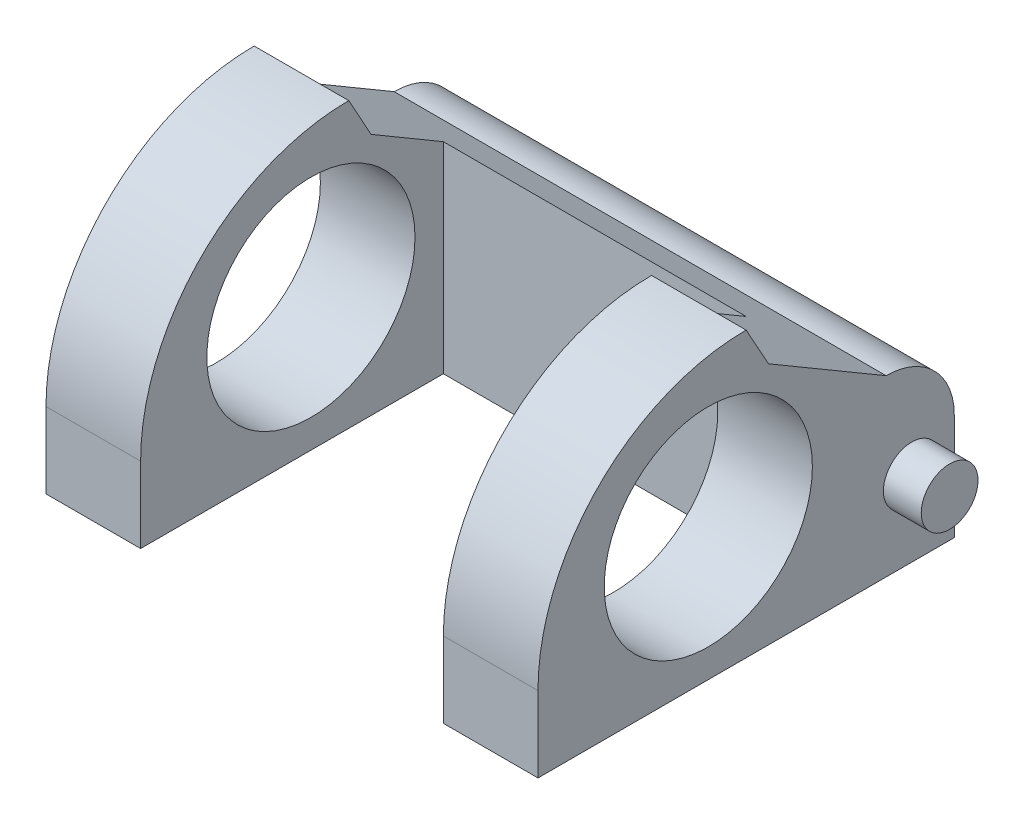
ISO-10303-21;
HEADER;
FILE_DESCRIPTION(('STEP AP214'),'2;1');
FILE_NAME('part.step','',(''),(''),'','','');
FILE_SCHEMA(('AUTOMOTIVE_DESIGN { 1 0 10303 214 1 1 1 1 }'));
ENDSEC;
DATA;
#1=APPLICATION_CONTEXT('core data for automotive mechanical design processes');
#2=APPLICATION_PROTOCOL_DEFINITION('international standard','automotive_design',2000,#1);
#3=PRODUCT_CONTEXT('',#1,'mechanical');
#4=PRODUCT('Part','Part','',(#3));
#5=PRODUCT_RELATED_PRODUCT_CATEGORY('part','',(#4));
#6=PRODUCT_DEFINITION_FORMATION('','',#4);
#7=PRODUCT_DEFINITION_CONTEXT('part definition',#1,'design');
#8=PRODUCT_DEFINITION('design','',#6,#7);
#9=PRODUCT_DEFINITION_SHAPE('','',#8);
#10=(LENGTH_UNIT() NAMED_UNIT(*) SI_UNIT(.MILLI.,.METRE.));
#11=(NAMED_UNIT(*) PLANE_ANGLE_UNIT() SI_UNIT($,.RADIAN.));
#12=(NAMED_UNIT(*) SI_UNIT($,.STERADIAN.) SOLID_ANGLE_UNIT());
#13=UNCERTAINTY_MEASURE_WITH_UNIT(LENGTH_MEASURE(1.E-05),#10,'distance_accuracy_value','');
#14=(GEOMETRIC_REPRESENTATION_CONTEXT(3) GLOBAL_UNCERTAINTY_ASSIGNED_CONTEXT((#13)) GLOBAL_UNIT_ASSIGNED_CONTEXT((#10,
#11,#12)) REPRESENTATION_CONTEXT('',''));
#15=CARTESIAN_POINT('',(0.,0.,0.));
#16=DIRECTION('',(0.,0.,1.));
#17=DIRECTION('',(1.,0.,0.));
#18=AXIS2_PLACEMENT_3D('',#15,#16,#17);
#19=CARTESIAN_POINT('',(-6.5,10.,5.5));
#20=DIRECTION('',(0.,0.,-1.));
#21=DIRECTION('',(-1.,0.,0.));
#22=AXIS2_PLACEMENT_3D('',#19,#20,#21);
#23=PLANE('',#22);
#24=DIRECTION('',(1.,0.,0.));
#25=VECTOR('',#24,1.);
#26=CARTESIAN_POINT('',(-6.5,2.,5.5));
#27=LINE('',#26,#25);
#28=CARTESIAN_POINT('',(4.,2.,5.5));
#29=VERTEX_POINT('',#28);
#30=CARTESIAN_POINT('',(6.5,2.,5.5));
#31=VERTEX_POINT('',#30);
#32=EDGE_CURVE('E279',#29,#31,#27,.T.);
#33=ORIENTED_EDGE('',*,*,#32,.F.);
#34=DIRECTION('',(0.,-1.,0.));
#35=VECTOR('',#34,1.);
#36=CARTESIAN_POINT('',(4.,7.5,5.5));
#37=LINE('',#36,#35);
#38=CARTESIAN_POINT('',(4.,0.,5.5));
#39=VERTEX_POINT('',#38);
#40=EDGE_CURVE('E182',#29,#39,#37,.T.);
#41=ORIENTED_EDGE('',*,*,#40,.T.);
#42=DIRECTION('',(1.,0.,0.));
#43=VECTOR('',#42,1.);
#44=CARTESIAN_POINT('',(-6.5,0.,5.5));
#45=LINE('',#44,#43);
#46=CARTESIAN_POINT('',(6.5,0.,5.5));
#47=VERTEX_POINT('',#46);
#48=EDGE_CURVE('E87',#39,#47,#45,.T.);
#49=ORIENTED_EDGE('',*,*,#48,.T.);
#50=DIRECTION('',(0.,-1.,0.));
#51=VECTOR('',#50,1.);
#52=CARTESIAN_POINT('',(6.5,10.,5.5));
#53=LINE('',#52,#51);
#54=EDGE_CURVE('E306',#31,#47,#53,.T.);
#55=ORIENTED_EDGE('',*,*,#54,.F.);
#56=EDGE_LOOP('',(#33,#41,#49,#55));
#57=FACE_BOUND('',#56,.T.);
#58=ADVANCED_FACE('F63',(#57),#23,.F.);
#59=CARTESIAN_POINT('',(-6.5,1.75754402478739,-3.17688828680512));
#60=DIRECTION('',(0.,-0.484085946196526,0.875020455015204));
#61=DIRECTION('',(0.,-0.875020455015204,-0.484085946196526));
#62=AXIS2_PLACEMENT_3D('',#59,#60,#61);
#63=PLANE('',#62);
#64=DIRECTION('',(1.,0.,0.));
#65=VECTOR('',#64,1.);
#66=CARTESIAN_POINT('',(-6.5,6.43285410885197,-0.590375145501196));
#67=LINE('',#66,#65);
#68=CARTESIAN_POINT('',(4.,6.43285410885197,-0.590375145501196));
#69=VERTEX_POINT('',#68);
#70=CARTESIAN_POINT('',(6.5,6.43285410885197,-0.590375145501199));
#71=VERTEX_POINT('',#70);
#72=EDGE_CURVE('E270',#69,#71,#67,.T.);
#73=ORIENTED_EDGE('',*,*,#72,.F.);
#74=DIRECTION('',(0.,0.875020455015204,0.484085946196526));
#75=VECTOR('',#74,1.);
#76=CARTESIAN_POINT('',(4.,1.75754402478739,-3.17688828680512));
#77=LINE('',#76,#75);
#78=CARTESIAN_POINT('',(4.,7.5,0.));
#79=VERTEX_POINT('',#78);
#80=EDGE_CURVE('E211',#69,#79,#77,.T.);
#81=ORIENTED_EDGE('',*,*,#80,.T.);
#82=DIRECTION('',(1.,0.,0.));
#83=VECTOR('',#82,1.);
#84=CARTESIAN_POINT('',(-6.5,7.5,0.));
#85=LINE('',#84,#83);
#86=CARTESIAN_POINT('',(6.5,7.5,0.));
#87=VERTEX_POINT('',#86);
#88=EDGE_CURVE('E275',#79,#87,#85,.T.);
#89=ORIENTED_EDGE('',*,*,#88,.T.);
#90=DIRECTION('',(0.,-0.875020455015204,-0.484085946196526));
#91=VECTOR('',#90,1.);
#92=CARTESIAN_POINT('',(6.5,1.75754402478739,-3.17688828680512));
#93=LINE('',#92,#91);
#94=EDGE_CURVE('E255',#87,#71,#93,.T.);
#95=ORIENTED_EDGE('',*,*,#94,.T.);
#96=EDGE_LOOP('',(#73,#81,#89,#95));
#97=FACE_BOUND('',#96,.T.);
#98=ADVANCED_FACE('F370',(#97),#63,.F.);
#99=CARTESIAN_POINT('',(-6.5,2.,0.));
#100=DIRECTION('',(1.,0.,0.));
#101=DIRECTION('',(0.,0.,-1.));
#102=AXIS2_PLACEMENT_3D('',#99,#100,#101);
#103=CYLINDRICAL_SURFACE('',#102,5.5);
#104=CARTESIAN_POINT('',(4.,2.,0.));
#105=DIRECTION('',(1.,0.,0.));
#106=DIRECTION('',(0.,0.,-1.));
#107=AXIS2_PLACEMENT_3D('',#104,#105,#106);
#108=CIRCLE('',#107,5.5);
#109=EDGE_CURVE('E215',#29,#79,#108,.F.);
#110=ORIENTED_EDGE('',*,*,#109,.F.);
#111=ORIENTED_EDGE('',*,*,#32,.T.);
#112=CARTESIAN_POINT('',(6.5,2.,0.));
#113=DIRECTION('',(1.,0.,0.));
#114=DIRECTION('',(0.,0.,-1.));
#115=AXIS2_PLACEMENT_3D('',#112,#113,#114);
#116=CIRCLE('',#115,5.5);
#117=EDGE_CURVE('E251',#87,#31,#116,.T.);
#118=ORIENTED_EDGE('',*,*,#117,.F.);
#119=ORIENTED_EDGE('',*,*,#88,.F.);
#120=EDGE_LOOP('',(#110,#111,#118,#119));
#121=FACE_BOUND('',#120,.T.);
#122=ADVANCED_FACE('F387',(#121),#103,.T.);
#123=CARTESIAN_POINT('',(-6.5,3.5,1.));
#124=DIRECTION('',(1.,0.,0.));
#125=DIRECTION('',(0.,0.,-1.));
#126=AXIS2_PLACEMENT_3D('',#123,#124,#125);
#127=CYLINDRICAL_SURFACE('',#126,2.75);
#128=CARTESIAN_POINT('',(4.,3.5,1.));
#129=DIRECTION('',(1.,0.,0.));
#130=DIRECTION('',(0.,0.,-1.));
#131=AXIS2_PLACEMENT_3D('',#128,#129,#130);
#132=CIRCLE('',#131,2.75);
#133=CARTESIAN_POINT('',(4.,3.5,-1.75));
#134=VERTEX_POINT('',#133);
#135=EDGE_CURVE('E218',#134,#134,#132,.F.);
#136=CARTESIAN_POINT('',(6.5,3.5,1.));
#137=DIRECTION('',(1.,0.,0.));
#138=DIRECTION('',(0.,0.,-1.));
#139=AXIS2_PLACEMENT_3D('',#136,#137,#138);
#140=CIRCLE('',#139,2.75);
#141=CARTESIAN_POINT('',(6.5,3.5,-1.75));
#142=VERTEX_POINT('',#141);
#143=EDGE_CURVE('E265',#142,#142,#140,.T.);
#144=CARTESIAN_POINT('',(4.,3.5,-1.75));
#145=CARTESIAN_POINT('',(4.02604166666667,3.5,-1.75));
#146=CARTESIAN_POINT('',(4.05208333333334,3.5,-1.75));
#147=CARTESIAN_POINT('',(4.10416666666667,3.5,-1.75));
#148=CARTESIAN_POINT('',(4.13020833333334,3.5,-1.75));
#149=CARTESIAN_POINT('',(4.18229166666667,3.5,-1.75));
#150=CARTESIAN_POINT('',(4.20833333333334,3.5,-1.75));
#151=CARTESIAN_POINT('',(4.26041666666667,3.5,-1.75));
#152=CARTESIAN_POINT('',(4.28645833333334,3.5,-1.75));
#153=CARTESIAN_POINT('',(4.33854166666667,3.5,-1.75));
#154=CARTESIAN_POINT('',(4.36458333333334,3.5,-1.75));
#155=CARTESIAN_POINT('',(4.41666666666667,3.5,-1.75));
#156=CARTESIAN_POINT('',(4.44270833333334,3.5,-1.75));
#157=CARTESIAN_POINT('',(4.49479166666667,3.5,-1.75));
#158=CARTESIAN_POINT('',(4.52083333333334,3.5,-1.75));
#159=CARTESIAN_POINT('',(4.57291666666667,3.5,-1.75));
#160=CARTESIAN_POINT('',(4.59895833333334,3.5,-1.75));
#161=CARTESIAN_POINT('',(4.65104166666667,3.5,-1.75));
#162=CARTESIAN_POINT('',(4.67708333333334,3.5,-1.75));
#163=CARTESIAN_POINT('',(4.72916666666667,3.5,-1.75));
#164=CARTESIAN_POINT('',(4.75520833333334,3.5,-1.75));
#165=CARTESIAN_POINT('',(4.80729166666667,3.5,-1.75));
#166=CARTESIAN_POINT('',(4.83333333333334,3.5,-1.75));
#167=CARTESIAN_POINT('',(4.88541666666667,3.5,-1.75));
#168=CARTESIAN_POINT('',(4.91145833333334,3.5,-1.75));
#169=CARTESIAN_POINT('',(4.96354166666667,3.5,-1.75));
#170=CARTESIAN_POINT('',(4.98958333333334,3.5,-1.75));
#171=CARTESIAN_POINT('',(5.04166666666667,3.5,-1.75));
#172=CARTESIAN_POINT('',(5.06770833333334,3.5,-1.75));
#173=CARTESIAN_POINT('',(5.11979166666667,3.5,-1.75));
#174=CARTESIAN_POINT('',(5.14583333333334,3.5,-1.75));
#175=CARTESIAN_POINT('',(5.19791666666667,3.5,-1.75));
#176=CARTESIAN_POINT('',(5.22395833333334,3.5,-1.75));
#177=CARTESIAN_POINT('',(5.27604166666667,3.5,-1.75));
#178=CARTESIAN_POINT('',(5.30208333333334,3.5,-1.75));
#179=CARTESIAN_POINT('',(5.35416666666667,3.5,-1.75));
#180=CARTESIAN_POINT('',(5.38020833333334,3.5,-1.75));
#181=CARTESIAN_POINT('',(5.43229166666667,3.5,-1.75));
#182=CARTESIAN_POINT('',(5.45833333333334,3.5,-1.75));
#183=CARTESIAN_POINT('',(5.51041666666667,3.5,-1.75));
#184=CARTESIAN_POINT('',(5.53645833333334,3.5,-1.75));
#185=CARTESIAN_POINT('',(5.58854166666667,3.5,-1.75));
#186=CARTESIAN_POINT('',(5.61458333333333,3.5,-1.75));
#187=CARTESIAN_POINT('',(5.66666666666667,3.5,-1.75));
#188=CARTESIAN_POINT('',(5.69270833333333,3.5,-1.75));
#189=CARTESIAN_POINT('',(5.74479166666667,3.5,-1.75));
#190=CARTESIAN_POINT('',(5.77083333333333,3.5,-1.75));
#191=CARTESIAN_POINT('',(5.82291666666667,3.5,-1.75));
#192=CARTESIAN_POINT('',(5.84895833333333,3.5,-1.75));
#193=CARTESIAN_POINT('',(5.90104166666667,3.5,-1.75));
#194=CARTESIAN_POINT('',(5.92708333333333,3.5,-1.75));
#195=CARTESIAN_POINT('',(5.97916666666667,3.5,-1.75));
#196=CARTESIAN_POINT('',(6.00520833333333,3.5,-1.75));
#197=CARTESIAN_POINT('',(6.05729166666667,3.5,-1.75));
#198=CARTESIAN_POINT('',(6.08333333333333,3.5,-1.75));
#199=CARTESIAN_POINT('',(6.13541666666667,3.5,-1.75));
#200=CARTESIAN_POINT('',(6.16145833333333,3.5,-1.75));
#201=CARTESIAN_POINT('',(6.21354166666667,3.5,-1.75));
#202=CARTESIAN_POINT('',(6.23958333333333,3.5,-1.75));
#203=CARTESIAN_POINT('',(6.29166666666667,3.5,-1.75));
#204=CARTESIAN_POINT('',(6.31770833333333,3.5,-1.75));
#205=CARTESIAN_POINT('',(6.36979166666667,3.5,-1.75));
#206=CARTESIAN_POINT('',(6.39583333333333,3.5,-1.75));
#207=CARTESIAN_POINT('',(6.44791666666667,3.5,-1.75));
#208=CARTESIAN_POINT('',(6.47395833333333,3.5,-1.75));
#209=CARTESIAN_POINT('',(6.5,3.5,-1.75));
#210=B_SPLINE_CURVE_WITH_KNOTS('',3,(#144,#145,#146,#147,#148,#149,#150,#151,#152,#153,#154,
#155,#156,#157,#158,#159,#160,#161,#162,#163,#164,#165,#166,#167,#168,#169,#170,#171,#172,#173,
#174,#175,#176,#177,#178,#179,#180,#181,#182,#183,#184,#185,#186,#187,#188,#189,#190,#191,#192,
#193,#194,#195,#196,#197,#198,#199,#200,#201,#202,#203,#204,#205,#206,#207,#208,#209),
.UNSPECIFIED.,.F.,.F.,(4,2,2,2,2,2,2,2,2,2,2,2,2,2,2,2,2,2,2,2,2,2,2,2,2,2,2,2,2,2,2,2,4),(0.,
0.0781250000000001,0.15625,0.234375,0.3125,0.390624999999999,0.468749999999999,
0.546874999999999,0.624999999999999,0.703124999999999,0.781249999999999,0.859374999999999,
0.937499999999997,1.015625,1.09375,1.171875,1.25,1.328125,1.40625,1.484375,1.5625,1.640625,
1.71875,1.796875,1.875,1.953125,2.03125,2.109375,2.1875,2.265625,2.34375,2.421875,2.5),.UNSPECIFIED.);
#211=EDGE_CURVE('BSEAM395',#134,#142,#210,.T.);
#212=ORIENTED_EDGE('',*,*,#135,.T.);
#213=ORIENTED_EDGE('',*,*,#143,.T.);
#214=ORIENTED_EDGE('',*,*,#211,.T.);
#215=ORIENTED_EDGE('',*,*,#211,.F.);
#216=EDGE_LOOP('',(#212,#214,#213,#215));
#217=FACE_BOUND('',#216,.T.);
#218=ADVANCED_FACE('F395',(#217),#127,.F.);
#219=CARTESIAN_POINT('',(6.5,10.,-5.5));
#220=DIRECTION('',(-1.,0.,0.));
#221=DIRECTION('',(0.,0.,1.));
#222=AXIS2_PLACEMENT_3D('',#219,#220,#221);
#223=PLANE('',#222);
#224=CARTESIAN_POINT('',(6.5,2.,-4.37642552574147));
#225=DIRECTION('',(-1.,0.,0.));
#226=DIRECTION('',(0.,0.,1.));
#227=AXIS2_PLACEMENT_3D('',#224,#225,#226);
#228=CIRCLE('',#227,0.75);
#229=CARTESIAN_POINT('',(6.5,2.,-3.62642552574147));
#230=VERTEX_POINT('',#229);
#231=EDGE_CURVE('E318',#230,#230,#228,.F.);
#232=ORIENTED_EDGE('',*,*,#231,.F.);
#233=EDGE_LOOP('',(#232));
#234=FACE_BOUND('',#233,.T.);
#235=ORIENTED_EDGE('',*,*,#143,.F.);
#236=EDGE_LOOP('',(#235));
#237=FACE_BOUND('',#236,.T.);
#238=CARTESIAN_POINT('',(6.5,2.80540416797783,-3.69896475102631));
#239=DIRECTION('',(1.,0.,0.));
#240=DIRECTION('',(0.,0.,-1.));
#241=AXIS2_PLACEMENT_3D('',#238,#239,#240);
#242=CIRCLE('',#241,1.80103524897368);
#243=CARTESIAN_POINT('',(6.5,2.80540416797783,-5.5));
#244=VERTEX_POINT('',#243);
#245=CARTESIAN_POINT('',(6.5,4.60643941695151,-3.69896475102631));
#246=VERTEX_POINT('',#245);
#247=EDGE_CURVE('E232',#244,#246,#242,.T.);
#248=ORIENTED_EDGE('',*,*,#247,.T.);
#249=DIRECTION('',(0.,-0.506573440578903,-0.862196815872138));
#250=VECTOR('',#249,1.);
#251=CARTESIAN_POINT('',(6.5,5.03993242820856,-2.96115209827151));
#252=LINE('',#251,#250);
#253=EDGE_CURVE('E236',#71,#246,#252,.T.);
#254=ORIENTED_EDGE('',*,*,#253,.F.);
#255=ORIENTED_EDGE('',*,*,#94,.F.);
#256=ORIENTED_EDGE('',*,*,#117,.T.);
#257=ORIENTED_EDGE('',*,*,#54,.T.);
#258=DIRECTION('',(0.,0.,-1.));
#259=VECTOR('',#258,1.);
#260=CARTESIAN_POINT('',(6.5,0.,-5.5));
#261=LINE('',#260,#259);
#262=CARTESIAN_POINT('',(6.5,0.,-5.5));
#263=VERTEX_POINT('',#262);
#264=EDGE_CURVE('E287',#47,#263,#261,.T.);
#265=ORIENTED_EDGE('',*,*,#264,.T.);
#266=DIRECTION('',(0.,-1.,0.));
#267=VECTOR('',#266,1.);
#268=CARTESIAN_POINT('',(6.5,10.,-5.5));
#269=LINE('',#268,#267);
#270=EDGE_CURVE('E315',#244,#263,#269,.T.);
#271=ORIENTED_EDGE('',*,*,#270,.F.);
#272=EDGE_LOOP('',(#248,#254,#255,#256,#257,#265,#271));
#273=FACE_BOUND('',#272,.T.);
#274=ADVANCED_FACE('F65',(#234,#237,#273),#223,.F.);
#275=CARTESIAN_POINT('',(-6.5,10.,-5.5));
#276=DIRECTION('',(1.,0.,0.));
#277=DIRECTION('',(0.,0.,-1.));
#278=AXIS2_PLACEMENT_3D('',#275,#276,#277);
#279=PLANE('',#278);
#280=CARTESIAN_POINT('',(-6.5,2.,-4.37642552574147));
#281=DIRECTION('',(1.,0.,0.));
#282=DIRECTION('',(0.,0.,-1.));
#283=AXIS2_PLACEMENT_3D('',#280,#281,#282);
#284=CIRCLE('',#283,0.75);
#285=CARTESIAN_POINT('',(-6.5,2.,-5.12642552574147));
#286=VERTEX_POINT('',#285);
#287=EDGE_CURVE('E222',#286,#286,#284,.T.);
#288=ORIENTED_EDGE('',*,*,#287,.T.);
#289=EDGE_LOOP('',(#288));
#290=FACE_BOUND('',#289,.T.);
#291=CARTESIAN_POINT('',(-6.5,3.5,1.));
#292=DIRECTION('',(1.,0.,0.));
#293=DIRECTION('',(0.,0.,-1.));
#294=AXIS2_PLACEMENT_3D('',#291,#292,#293);
#295=CIRCLE('',#294,2.75);
#296=CARTESIAN_POINT('',(-6.5,3.5,-1.75));
#297=VERTEX_POINT('',#296);
#298=EDGE_CURVE('E283',#297,#297,#295,.T.);
#299=ORIENTED_EDGE('',*,*,#298,.T.);
#300=EDGE_LOOP('',(#299));
#301=FACE_BOUND('',#300,.T.);
#302=CARTESIAN_POINT('',(-6.5,2.80540416797783,-3.69896475102631));
#303=DIRECTION('',(1.,0.,0.));
#304=DIRECTION('',(0.,0.,-1.));
#305=AXIS2_PLACEMENT_3D('',#302,#303,#304);
#306=CIRCLE('',#305,1.80103524897368);
#307=CARTESIAN_POINT('',(-6.5,2.80540416797783,-5.5));
#308=VERTEX_POINT('',#307);
#309=CARTESIAN_POINT('',(-6.5,4.60643941695151,-3.69896475102631));
#310=VERTEX_POINT('',#309);
#311=EDGE_CURVE('E233',#308,#310,#306,.T.);
#312=ORIENTED_EDGE('',*,*,#311,.F.);
#313=DIRECTION('',(0.,-1.,0.));
#314=VECTOR('',#313,1.);
#315=CARTESIAN_POINT('',(-6.5,10.,-5.5));
#316=LINE('',#315,#314);
#317=CARTESIAN_POINT('',(-6.5,0.,-5.5));
#318=VERTEX_POINT('',#317);
#319=EDGE_CURVE('E312',#308,#318,#316,.T.);
#320=ORIENTED_EDGE('',*,*,#319,.T.);
#321=DIRECTION('',(0.,0.,1.));
#322=VECTOR('',#321,1.);
#323=CARTESIAN_POINT('',(-6.5,0.,-5.5));
#324=LINE('',#323,#322);
#325=CARTESIAN_POINT('',(-6.5,0.,5.5));
#326=VERTEX_POINT('',#325);
#327=EDGE_CURVE('E298',#318,#326,#324,.T.);
#328=ORIENTED_EDGE('',*,*,#327,.T.);
#329=DIRECTION('',(0.,-1.,0.));
#330=VECTOR('',#329,1.);
#331=CARTESIAN_POINT('',(-6.5,10.,5.5));
#332=LINE('',#331,#330);
#333=CARTESIAN_POINT('',(-6.5,2.,5.5));
#334=VERTEX_POINT('',#333);
#335=EDGE_CURVE('E309',#334,#326,#332,.T.);
#336=ORIENTED_EDGE('',*,*,#335,.F.);
#337=CARTESIAN_POINT('',(-6.5,2.,0.));
#338=DIRECTION('',(1.,0.,0.));
#339=DIRECTION('',(0.,0.,-1.));
#340=AXIS2_PLACEMENT_3D('',#337,#338,#339);
#341=CIRCLE('',#340,5.5);
#342=CARTESIAN_POINT('',(-6.5,7.5,0.));
#343=VERTEX_POINT('',#342);
#344=EDGE_CURVE('E79',#343,#334,#341,.T.);
#345=ORIENTED_EDGE('',*,*,#344,.F.);
#346=DIRECTION('',(0.,-0.875020455015204,-0.484085946196526));
#347=VECTOR('',#346,1.);
#348=CARTESIAN_POINT('',(-6.5,1.75754402478739,-3.17688828680512));
#349=LINE('',#348,#347);
#350=CARTESIAN_POINT('',(-6.5,6.43285410885197,-0.590375145501196));
#351=VERTEX_POINT('',#350);
#352=EDGE_CURVE('E239',#343,#351,#349,.T.);
#353=ORIENTED_EDGE('',*,*,#352,.T.);
#354=DIRECTION('',(0.,-0.506573440578903,-0.862196815872138));
#355=VECTOR('',#354,1.);
#356=CARTESIAN_POINT('',(-6.5,5.03993242820856,-2.9611520982715));
#357=LINE('',#356,#355);
#358=EDGE_CURVE('E243',#351,#310,#357,.T.);
#359=ORIENTED_EDGE('',*,*,#358,.T.);
#360=EDGE_LOOP('',(#312,#320,#328,#336,#345,#353,#359));
#361=FACE_BOUND('',#360,.T.);
#362=ADVANCED_FACE('F345',(#290,#301,#361),#279,.F.);
#363=CARTESIAN_POINT('',(-4.,0.,5.5));
#364=VERTEX_POINT('',#363);
#365=EDGE_CURVE('E302',#326,#364,#45,.T.);
#366=ORIENTED_EDGE('',*,*,#365,.T.);
#367=DIRECTION('',(0.,-1.,0.));
#368=VECTOR('',#367,1.);
#369=CARTESIAN_POINT('',(-4.,7.5,5.5));
#370=LINE('',#369,#368);
#371=CARTESIAN_POINT('',(-4.,2.,5.5));
#372=VERTEX_POINT('',#371);
#373=EDGE_CURVE('E189',#372,#364,#370,.T.);
#374=ORIENTED_EDGE('',*,*,#373,.F.);
#375=EDGE_CURVE('E276',#334,#372,#27,.T.);
#376=ORIENTED_EDGE('',*,*,#375,.F.);
#377=ORIENTED_EDGE('',*,*,#335,.T.);
#378=EDGE_LOOP('',(#366,#374,#376,#377));
#379=FACE_BOUND('',#378,.T.);
#380=ADVANCED_FACE('F349',(#379),#23,.F.);
#381=CARTESIAN_POINT('',(-6.5,10.,-5.5));
#382=DIRECTION('',(0.,0.,1.));
#383=DIRECTION('',(1.,0.,0.));
#384=AXIS2_PLACEMENT_3D('',#381,#382,#383);
#385=PLANE('',#384);
#386=ORIENTED_EDGE('',*,*,#319,.F.);
#387=DIRECTION('',(1.,0.,0.));
#388=VECTOR('',#387,1.);
#389=CARTESIAN_POINT('',(-6.5,2.80540416797783,-5.5));
#390=LINE('',#389,#388);
#391=EDGE_CURVE('E247',#308,#244,#390,.T.);
#392=ORIENTED_EDGE('',*,*,#391,.T.);
#393=ORIENTED_EDGE('',*,*,#270,.T.);
#394=DIRECTION('',(-1.,0.,0.));
#395=VECTOR('',#394,1.);
#396=CARTESIAN_POINT('',(-6.5,0.,-5.5));
#397=LINE('',#396,#395);
#398=EDGE_CURVE('E294',#263,#318,#397,.T.);
#399=ORIENTED_EDGE('',*,*,#398,.T.);
#400=EDGE_LOOP('',(#386,#392,#393,#399));
#401=FACE_BOUND('',#400,.T.);
#402=ADVANCED_FACE('F374',(#401),#385,.F.);
#403=CARTESIAN_POINT('',(0.,0.,0.));
#404=DIRECTION('',(0.,1.,0.));
#405=DIRECTION('',(0.,0.,1.));
#406=AXIS2_PLACEMENT_3D('',#403,#404,#405);
#407=PLANE('',#406);
#408=ORIENTED_EDGE('',*,*,#48,.F.);
#409=DIRECTION('',(0.,0.,1.));
#410=VECTOR('',#409,1.);
#411=CARTESIAN_POINT('',(4.,0.,5.5));
#412=LINE('',#411,#410);
#413=CARTESIAN_POINT('',(4.,0.,-2.5));
#414=VERTEX_POINT('',#413);
#415=EDGE_CURVE('E180',#414,#39,#412,.T.);
#416=ORIENTED_EDGE('',*,*,#415,.F.);
#417=DIRECTION('',(1.,0.,0.));
#418=VECTOR('',#417,1.);
#419=CARTESIAN_POINT('',(3.5,0.,-2.5));
#420=LINE('',#419,#418);
#421=CARTESIAN_POINT('',(-4.,0.,-2.5));
#422=VERTEX_POINT('',#421);
#423=EDGE_CURVE('E162',#422,#414,#420,.T.);
#424=ORIENTED_EDGE('',*,*,#423,.F.);
#425=DIRECTION('',(0.,0.,-1.));
#426=VECTOR('',#425,1.);
#427=CARTESIAN_POINT('',(-4.,0.,5.5));
#428=LINE('',#427,#426);
#429=EDGE_CURVE('E195',#364,#422,#428,.T.);
#430=ORIENTED_EDGE('',*,*,#429,.F.);
#431=ORIENTED_EDGE('',*,*,#365,.F.);
#432=ORIENTED_EDGE('',*,*,#327,.F.);
#433=ORIENTED_EDGE('',*,*,#398,.F.);
#434=ORIENTED_EDGE('',*,*,#264,.F.);
#435=EDGE_LOOP('',(#408,#416,#424,#430,#431,#432,#433,#434));
#436=FACE_BOUND('',#435,.T.);
#437=ADVANCED_FACE('F184',(#436),#407,.F.);
#438=CARTESIAN_POINT('',(-6.5,2.80540416797783,-3.69896475102631));
#439=DIRECTION('',(1.,0.,0.));
#440=DIRECTION('',(0.,0.,-1.));
#441=AXIS2_PLACEMENT_3D('',#438,#439,#440);
#442=CYLINDRICAL_SURFACE('',#441,1.80103524897368);
#443=ORIENTED_EDGE('',*,*,#247,.F.);
#444=ORIENTED_EDGE('',*,*,#391,.F.);
#445=ORIENTED_EDGE('',*,*,#311,.T.);
#446=DIRECTION('',(1.,0.,0.));
#447=VECTOR('',#446,1.);
#448=CARTESIAN_POINT('',(-6.5,4.60643941695151,-3.69896475102631));
#449=LINE('',#448,#447);
#450=EDGE_CURVE('E262',#310,#246,#449,.T.);
#451=ORIENTED_EDGE('',*,*,#450,.T.);
#452=EDGE_LOOP('',(#443,#444,#445,#451));
#453=FACE_BOUND('',#452,.T.);
#454=ADVANCED_FACE('F373',(#453),#442,.T.);
#455=CARTESIAN_POINT('',(-6.5,5.03993242820856,-2.9611520982715));
#456=DIRECTION('',(0.,-0.862196815872138,0.506573440578903));
#457=DIRECTION('',(0.,-0.506573440578902,-0.862196815872138));
#458=AXIS2_PLACEMENT_3D('',#455,#456,#457);
#459=PLANE('',#458);
#460=DIRECTION('',(1.,0.,0.));
#461=VECTOR('',#460,1.);
#462=CARTESIAN_POINT('',(-6.5,5.31087683527561,-2.5));
#463=LINE('',#462,#461);
#464=CARTESIAN_POINT('',(-4.,5.31087683527561,-2.5));
#465=VERTEX_POINT('',#464);
#466=CARTESIAN_POINT('',(4.,5.31087683527561,-2.5));
#467=VERTEX_POINT('',#466);
#468=EDGE_CURVE('E72',#465,#467,#463,.T.);
#469=ORIENTED_EDGE('',*,*,#468,.T.);
#470=DIRECTION('',(0.,0.506573440578902,0.862196815872138));
#471=VECTOR('',#470,1.);
#472=CARTESIAN_POINT('',(4.,5.03993242820856,-2.9611520982715));
#473=LINE('',#472,#471);
#474=EDGE_CURVE('E12',#467,#69,#473,.T.);
#475=ORIENTED_EDGE('',*,*,#474,.T.);
#476=ORIENTED_EDGE('',*,*,#72,.T.);
#477=ORIENTED_EDGE('',*,*,#253,.T.);
#478=ORIENTED_EDGE('',*,*,#450,.F.);
#479=ORIENTED_EDGE('',*,*,#358,.F.);
#480=CARTESIAN_POINT('',(-4.,6.43285410885197,-0.590375145501196));
#481=VERTEX_POINT('',#480);
#482=EDGE_CURVE('E266',#351,#481,#67,.T.);
#483=ORIENTED_EDGE('',*,*,#482,.T.);
#484=DIRECTION('',(0.,-0.506573440578902,-0.862196815872138));
#485=VECTOR('',#484,1.);
#486=CARTESIAN_POINT('',(-4.,5.03993242820856,-2.9611520982715));
#487=LINE('',#486,#485);
#488=EDGE_CURVE('E207',#481,#465,#487,.T.);
#489=ORIENTED_EDGE('',*,*,#488,.T.);
#490=EDGE_LOOP('',(#469,#475,#476,#477,#478,#479,#483,#489));
#491=FACE_BOUND('',#490,.T.);
#492=ADVANCED_FACE('F366',(#491),#459,.F.);
#493=CARTESIAN_POINT('',(-4.,7.5,0.));
#494=VERTEX_POINT('',#493);
#495=EDGE_CURVE('E271',#343,#494,#85,.T.);
#496=ORIENTED_EDGE('',*,*,#495,.T.);
#497=DIRECTION('',(0.,-0.875020455015204,-0.484085946196526));
#498=VECTOR('',#497,1.);
#499=CARTESIAN_POINT('',(-4.,1.75754402478739,-3.17688828680512));
#500=LINE('',#499,#498);
#501=EDGE_CURVE('E203',#494,#481,#500,.T.);
#502=ORIENTED_EDGE('',*,*,#501,.T.);
#503=ORIENTED_EDGE('',*,*,#482,.F.);
#504=ORIENTED_EDGE('',*,*,#352,.F.);
#505=EDGE_LOOP('',(#496,#502,#503,#504));
#506=FACE_BOUND('',#505,.T.);
#507=ADVANCED_FACE('F340',(#506),#63,.F.);
#508=CARTESIAN_POINT('',(-4.,2.,0.));
#509=DIRECTION('',(-1.,0.,0.));
#510=DIRECTION('',(0.,0.,1.));
#511=AXIS2_PLACEMENT_3D('',#508,#509,#510);
#512=CIRCLE('',#511,5.5);
#513=EDGE_CURVE('E200',#494,#372,#512,.F.);
#514=ORIENTED_EDGE('',*,*,#513,.F.);
#515=ORIENTED_EDGE('',*,*,#495,.F.);
#516=ORIENTED_EDGE('',*,*,#344,.T.);
#517=ORIENTED_EDGE('',*,*,#375,.T.);
#518=EDGE_LOOP('',(#514,#515,#516,#517));
#519=FACE_BOUND('',#518,.T.);
#520=ADVANCED_FACE('F338',(#519),#103,.T.);
#521=CARTESIAN_POINT('',(-4.,3.5,1.));
#522=DIRECTION('',(-1.,0.,0.));
#523=DIRECTION('',(0.,0.,1.));
#524=AXIS2_PLACEMENT_3D('',#521,#522,#523);
#525=CIRCLE('',#524,2.75);
#526=CARTESIAN_POINT('',(-4.,3.5,-1.75));
#527=VERTEX_POINT('',#526);
#528=EDGE_CURVE('E193',#527,#527,#525,.F.);
#529=CARTESIAN_POINT('',(-4.,3.5,-1.75));
#530=CARTESIAN_POINT('',(-4.02604166666667,3.5,-1.75));
#531=CARTESIAN_POINT('',(-4.05208333333333,3.5,-1.75));
#532=CARTESIAN_POINT('',(-4.10416666666667,3.5,-1.75));
#533=CARTESIAN_POINT('',(-4.13020833333333,3.5,-1.75));
#534=CARTESIAN_POINT('',(-4.18229166666667,3.5,-1.75));
#535=CARTESIAN_POINT('',(-4.20833333333333,3.5,-1.75));
#536=CARTESIAN_POINT('',(-4.26041666666667,3.5,-1.75));
#537=CARTESIAN_POINT('',(-4.28645833333333,3.5,-1.75));
#538=CARTESIAN_POINT('',(-4.33854166666667,3.5,-1.75));
#539=CARTESIAN_POINT('',(-4.36458333333333,3.5,-1.75));
#540=CARTESIAN_POINT('',(-4.41666666666667,3.5,-1.75));
#541=CARTESIAN_POINT('',(-4.44270833333333,3.5,-1.75));
#542=CARTESIAN_POINT('',(-4.49479166666667,3.5,-1.75));
#543=CARTESIAN_POINT('',(-4.52083333333333,3.5,-1.75));
#544=CARTESIAN_POINT('',(-4.57291666666667,3.5,-1.75));
#545=CARTESIAN_POINT('',(-4.59895833333333,3.5,-1.75));
#546=CARTESIAN_POINT('',(-4.65104166666666,3.5,-1.75));
#547=CARTESIAN_POINT('',(-4.67708333333333,3.5,-1.75));
#548=CARTESIAN_POINT('',(-4.72916666666666,3.5,-1.75));
#549=CARTESIAN_POINT('',(-4.75520833333333,3.5,-1.75));
#550=CARTESIAN_POINT('',(-4.80729166666666,3.5,-1.75));
#551=CARTESIAN_POINT('',(-4.83333333333333,3.5,-1.75));
#552=CARTESIAN_POINT('',(-4.88541666666666,3.5,-1.75));
#553=CARTESIAN_POINT('',(-4.91145833333333,3.5,-1.75));
#554=CARTESIAN_POINT('',(-4.96354166666666,3.5,-1.75));
#555=CARTESIAN_POINT('',(-4.98958333333333,3.5,-1.75));
#556=CARTESIAN_POINT('',(-5.04166666666667,3.5,-1.75));
#557=CARTESIAN_POINT('',(-5.06770833333333,3.5,-1.75));
#558=CARTESIAN_POINT('',(-5.11979166666667,3.5,-1.75));
#559=CARTESIAN_POINT('',(-5.14583333333333,3.5,-1.75));
#560=CARTESIAN_POINT('',(-5.19791666666667,3.5,-1.75));
#561=CARTESIAN_POINT('',(-5.22395833333333,3.5,-1.75));
#562=CARTESIAN_POINT('',(-5.27604166666667,3.5,-1.75));
#563=CARTESIAN_POINT('',(-5.30208333333333,3.5,-1.75));
#564=CARTESIAN_POINT('',(-5.35416666666667,3.5,-1.75));
#565=CARTESIAN_POINT('',(-5.38020833333333,3.5,-1.75));
#566=CARTESIAN_POINT('',(-5.43229166666667,3.5,-1.75));
#567=CARTESIAN_POINT('',(-5.45833333333333,3.5,-1.75));
#568=CARTESIAN_POINT('',(-5.51041666666667,3.5,-1.75));
#569=CARTESIAN_POINT('',(-5.53645833333333,3.5,-1.75));
#570=CARTESIAN_POINT('',(-5.58854166666667,3.5,-1.75));
#571=CARTESIAN_POINT('',(-5.61458333333333,3.5,-1.75));
#572=CARTESIAN_POINT('',(-5.66666666666667,3.5,-1.75));
#573=CARTESIAN_POINT('',(-5.69270833333333,3.5,-1.75));
#574=CARTESIAN_POINT('',(-5.74479166666667,3.5,-1.75));
#575=CARTESIAN_POINT('',(-5.77083333333333,3.5,-1.75));
#576=CARTESIAN_POINT('',(-5.82291666666667,3.5,-1.75));
#577=CARTESIAN_POINT('',(-5.84895833333333,3.5,-1.75));
#578=CARTESIAN_POINT('',(-5.90104166666667,3.5,-1.75));
#579=CARTESIAN_POINT('',(-5.92708333333333,3.5,-1.75));
#580=CARTESIAN_POINT('',(-5.97916666666667,3.5,-1.75));
#581=CARTESIAN_POINT('',(-6.00520833333333,3.5,-1.75));
#582=CARTESIAN_POINT('',(-6.05729166666667,3.5,-1.75));
#583=CARTESIAN_POINT('',(-6.08333333333333,3.5,-1.75));
#584=CARTESIAN_POINT('',(-6.13541666666667,3.5,-1.75));
#585=CARTESIAN_POINT('',(-6.16145833333333,3.5,-1.75));
#586=CARTESIAN_POINT('',(-6.21354166666667,3.5,-1.75));
#587=CARTESIAN_POINT('',(-6.23958333333333,3.5,-1.75));
#588=CARTESIAN_POINT('',(-6.29166666666667,3.5,-1.75));
#589=CARTESIAN_POINT('',(-6.31770833333333,3.5,-1.75));
#590=CARTESIAN_POINT('',(-6.36979166666667,3.5,-1.75));
#591=CARTESIAN_POINT('',(-6.39583333333333,3.5,-1.75));
#592=CARTESIAN_POINT('',(-6.44791666666667,3.5,-1.75));
#593=CARTESIAN_POINT('',(-6.47395833333333,3.5,-1.75));
#594=CARTESIAN_POINT('',(-6.5,3.5,-1.75));
#595=B_SPLINE_CURVE_WITH_KNOTS('',3,(#529,#530,#531,#532,#533,#534,#535,#536,#537,#538,#539,
#540,#541,#542,#543,#544,#545,#546,#547,#548,#549,#550,#551,#552,#553,#554,#555,#556,#557,#558,
#559,#560,#561,#562,#563,#564,#565,#566,#567,#568,#569,#570,#571,#572,#573,#574,#575,#576,#577,
#578,#579,#580,#581,#582,#583,#584,#585,#586,#587,#588,#589,#590,#591,#592,#593,#594),
.UNSPECIFIED.,.F.,.F.,(4,2,2,2,2,2,2,2,2,2,2,2,2,2,2,2,2,2,2,2,2,2,2,2,2,2,2,2,2,2,2,2,4),(0.,
0.0781250000000001,0.15625,0.234375,0.3125,0.390625,0.46875,0.546875,0.625,0.703125,0.78125,
0.859375,0.9375,1.015625,1.09375,1.171875,1.25,1.328125,1.40625,1.484375,1.5625,1.640625,
1.71875,1.796875,1.875,1.953125,2.03125,2.109375,2.1875,2.265625,2.34375,2.421875,2.5),.UNSPECIFIED.);
#596=EDGE_CURVE('BSEAM327',#527,#297,#595,.T.);
#597=ORIENTED_EDGE('',*,*,#528,.T.);
#598=ORIENTED_EDGE('',*,*,#298,.F.);
#599=ORIENTED_EDGE('',*,*,#596,.T.);
#600=ORIENTED_EDGE('',*,*,#596,.F.);
#601=EDGE_LOOP('',(#597,#599,#598,#600));
#602=FACE_BOUND('',#601,.T.);
#603=ADVANCED_FACE('F327',(#602),#127,.F.);
#604=CARTESIAN_POINT('',(7.5,2.,-4.37642552574147));
#605=DIRECTION('',(-1.,0.,0.));
#606=DIRECTION('',(0.,0.,1.));
#607=AXIS2_PLACEMENT_3D('',#604,#605,#606);
#608=CYLINDRICAL_SURFACE('',#607,0.75);
#609=CARTESIAN_POINT('',(7.5,2.,-4.37642552574147));
#610=DIRECTION('',(1.,0.,0.));
#611=DIRECTION('',(0.,0.,-1.));
#612=AXIS2_PLACEMENT_3D('',#609,#610,#611);
#613=CIRCLE('',#612,0.75);
#614=CARTESIAN_POINT('',(7.5,2.,-5.12642552574147));
#615=VERTEX_POINT('',#614);
#616=EDGE_CURVE('E173',#615,#615,#613,.T.);
#617=ORIENTED_EDGE('',*,*,#616,.F.);
#618=EDGE_LOOP('',(#617));
#619=FACE_BOUND('',#618,.T.);
#620=ORIENTED_EDGE('',*,*,#231,.T.);
#621=EDGE_LOOP('',(#620));
#622=FACE_BOUND('',#621,.T.);
#623=ADVANCED_FACE('F401',(#619,#622),#608,.T.);
#624=CARTESIAN_POINT('',(7.5,2.,-4.37642552574147));
#625=DIRECTION('',(1.,0.,0.));
#626=DIRECTION('',(0.,0.,-1.));
#627=AXIS2_PLACEMENT_3D('',#624,#625,#626);
#628=PLANE('',#627);
#629=ORIENTED_EDGE('',*,*,#616,.T.);
#630=EDGE_LOOP('',(#629));
#631=FACE_BOUND('',#630,.T.);
#632=ADVANCED_FACE('F406',(#631),#628,.T.);
#633=CARTESIAN_POINT('',(3.5,7.5,-2.5));
#634=DIRECTION('',(0.,0.,-1.));
#635=DIRECTION('',(-1.,0.,0.));
#636=AXIS2_PLACEMENT_3D('',#633,#634,#635);
#637=PLANE('',#636);
#638=ORIENTED_EDGE('',*,*,#468,.F.);
#639=DIRECTION('',(0.,-1.,0.));
#640=VECTOR('',#639,1.);
#641=CARTESIAN_POINT('',(-4.,7.5,-2.5));
#642=LINE('',#641,#640);
#643=EDGE_CURVE('E167',#465,#422,#642,.T.);
#644=ORIENTED_EDGE('',*,*,#643,.T.);
#645=ORIENTED_EDGE('',*,*,#423,.T.);
#646=DIRECTION('',(0.,-1.,0.));
#647=VECTOR('',#646,1.);
#648=CARTESIAN_POINT('',(4.,7.5,-2.5));
#649=LINE('',#648,#647);
#650=EDGE_CURVE('E165',#467,#414,#649,.T.);
#651=ORIENTED_EDGE('',*,*,#650,.F.);
#652=EDGE_LOOP('',(#638,#644,#645,#651));
#653=FACE_BOUND('',#652,.T.);
#654=ADVANCED_FACE('F164',(#653),#637,.F.);
#655=CARTESIAN_POINT('',(-7.5,2.,-4.37642552574147));
#656=DIRECTION('',(1.,0.,0.));
#657=DIRECTION('',(0.,0.,-1.));
#658=AXIS2_PLACEMENT_3D('',#655,#656,#657);
#659=CYLINDRICAL_SURFACE('',#658,0.75);
#660=CARTESIAN_POINT('',(-7.5,2.,-4.37642552574147));
#661=DIRECTION('',(1.,0.,0.));
#662=DIRECTION('',(0.,0.,-1.));
#663=AXIS2_PLACEMENT_3D('',#660,#661,#662);
#664=CIRCLE('',#663,0.75);
#665=CARTESIAN_POINT('',(-7.5,2.,-5.12642552574147));
#666=VERTEX_POINT('',#665);
#667=EDGE_CURVE('E174',#666,#666,#664,.T.);
#668=ORIENTED_EDGE('',*,*,#667,.T.);
#669=EDGE_LOOP('',(#668));
#670=FACE_BOUND('',#669,.T.);
#671=ORIENTED_EDGE('',*,*,#287,.F.);
#672=EDGE_LOOP('',(#671));
#673=FACE_BOUND('',#672,.T.);
#674=ADVANCED_FACE('F427',(#670,#673),#659,.T.);
#675=CARTESIAN_POINT('',(-7.5,2.,-4.37642552574147));
#676=DIRECTION('',(-1.,0.,0.));
#677=DIRECTION('',(0.,0.,-1.));
#678=AXIS2_PLACEMENT_3D('',#675,#676,#677);
#679=PLANE('',#678);
#680=ORIENTED_EDGE('',*,*,#667,.F.);
#681=EDGE_LOOP('',(#680));
#682=FACE_BOUND('',#681,.T.);
#683=ADVANCED_FACE('F333',(#682),#679,.T.);
#684=CARTESIAN_POINT('',(-4.,7.5,5.5));
#685=DIRECTION('',(-1.,0.,0.));
#686=DIRECTION('',(0.,0.,1.));
#687=AXIS2_PLACEMENT_3D('',#684,#685,#686);
#688=PLANE('',#687);
#689=ORIENTED_EDGE('',*,*,#528,.F.);
#690=EDGE_LOOP('',(#689));
#691=FACE_BOUND('',#690,.T.);
#692=ORIENTED_EDGE('',*,*,#501,.F.);
#693=ORIENTED_EDGE('',*,*,#513,.T.);
#694=ORIENTED_EDGE('',*,*,#373,.T.);
#695=ORIENTED_EDGE('',*,*,#429,.T.);
#696=ORIENTED_EDGE('',*,*,#643,.F.);
#697=ORIENTED_EDGE('',*,*,#488,.F.);
#698=EDGE_LOOP('',(#692,#693,#694,#695,#696,#697));
#699=FACE_BOUND('',#698,.T.);
#700=ADVANCED_FACE('F330',(#691,#699),#688,.F.);
#701=CARTESIAN_POINT('',(4.,7.5,5.5));
#702=DIRECTION('',(1.,0.,0.));
#703=DIRECTION('',(0.,0.,-1.));
#704=AXIS2_PLACEMENT_3D('',#701,#702,#703);
#705=PLANE('',#704);
#706=ORIENTED_EDGE('',*,*,#109,.T.);
#707=ORIENTED_EDGE('',*,*,#80,.F.);
#708=ORIENTED_EDGE('',*,*,#474,.F.);
#709=ORIENTED_EDGE('',*,*,#650,.T.);
#710=ORIENTED_EDGE('',*,*,#415,.T.);
#711=ORIENTED_EDGE('',*,*,#40,.F.);
#712=EDGE_LOOP('',(#706,#707,#708,#709,#710,#711));
#713=FACE_BOUND('',#712,.T.);
#714=ORIENTED_EDGE('',*,*,#135,.F.);
#715=EDGE_LOOP('',(#714));
#716=FACE_BOUND('',#715,.T.);
#717=ADVANCED_FACE('F178',(#713,#716),#705,.F.);
#718=CLOSED_SHELL('',(#58,#98,#122,#218,#274,#362,#380,#402,#437,#454,#492,#507,#520,#603,#623,
#632,#654,#674,#683,#700,#717));
#719=MANIFOLD_SOLID_BREP('B2',#718);
#720=ADVANCED_BREP_SHAPE_REPRESENTATION('',(#18,#719),#14);
#721=SHAPE_DEFINITION_REPRESENTATION(#9,#720);
ENDSEC;
END-ISO-10303-21;
